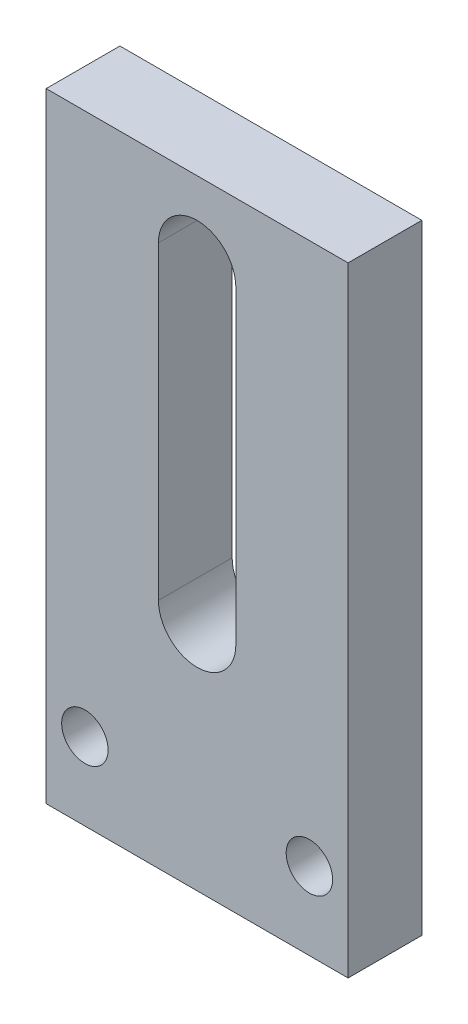
ISO-10303-21;
HEADER;
FILE_DESCRIPTION(('STEP AP214'),'2;1');
FILE_NAME('part.step','',(''),(''),'','','');
FILE_SCHEMA(('AUTOMOTIVE_DESIGN { 1 0 10303 214 1 1 1 1 }'));
ENDSEC;
DATA;
#1=APPLICATION_CONTEXT('core data for automotive mechanical design processes');
#2=APPLICATION_PROTOCOL_DEFINITION('international standard','automotive_design',2000,#1);
#3=PRODUCT_CONTEXT('',#1,'mechanical');
#4=PRODUCT('Part','Part','',(#3));
#5=PRODUCT_RELATED_PRODUCT_CATEGORY('part','',(#4));
#6=PRODUCT_DEFINITION_FORMATION('','',#4);
#7=PRODUCT_DEFINITION_CONTEXT('part definition',#1,'design');
#8=PRODUCT_DEFINITION('design','',#6,#7);
#9=PRODUCT_DEFINITION_SHAPE('','',#8);
#10=(LENGTH_UNIT() NAMED_UNIT(*) SI_UNIT(.MILLI.,.METRE.));
#11=(NAMED_UNIT(*) PLANE_ANGLE_UNIT() SI_UNIT($,.RADIAN.));
#12=(NAMED_UNIT(*) SI_UNIT($,.STERADIAN.) SOLID_ANGLE_UNIT());
#13=UNCERTAINTY_MEASURE_WITH_UNIT(LENGTH_MEASURE(1.E-05),#10,'distance_accuracy_value','');
#14=(GEOMETRIC_REPRESENTATION_CONTEXT(3) GLOBAL_UNCERTAINTY_ASSIGNED_CONTEXT((#13)) GLOBAL_UNIT_ASSIGNED_CONTEXT((#10,
#11,#12)) REPRESENTATION_CONTEXT('',''));
#15=CARTESIAN_POINT('',(0.,0.,0.));
#16=DIRECTION('',(0.,0.,1.));
#17=DIRECTION('',(1.,0.,0.));
#18=AXIS2_PLACEMENT_3D('',#15,#16,#17);
#19=CARTESIAN_POINT('',(9.75,35.,4.7625));
#20=DIRECTION('',(0.,0.,-1.));
#21=DIRECTION('',(-1.,0.,0.));
#22=AXIS2_PLACEMENT_3D('',#19,#20,#21);
#23=CYLINDRICAL_SURFACE('',#22,2.5);
#24=CARTESIAN_POINT('',(9.75,35.,0.));
#25=DIRECTION('',(0.,0.,1.));
#26=DIRECTION('',(1.,0.,0.));
#27=AXIS2_PLACEMENT_3D('',#24,#25,#26);
#28=CIRCLE('',#27,2.5);
#29=CARTESIAN_POINT('',(12.25,35.,0.));
#30=VERTEX_POINT('',#29);
#31=CARTESIAN_POINT('',(7.25,35.,0.));
#32=VERTEX_POINT('',#31);
#33=EDGE_CURVE('E152',#30,#32,#28,.T.);
#34=ORIENTED_EDGE('',*,*,#33,.F.);
#35=DIRECTION('',(0.,0.,-1.));
#36=VECTOR('',#35,1.);
#37=CARTESIAN_POINT('',(12.25,35.,4.7625));
#38=LINE('',#37,#36);
#39=CARTESIAN_POINT('',(12.25,35.,4.7625));
#40=VERTEX_POINT('',#39);
#41=EDGE_CURVE('E11',#40,#30,#38,.T.);
#42=ORIENTED_EDGE('',*,*,#41,.F.);
#43=CARTESIAN_POINT('',(9.75,35.,4.7625));
#44=DIRECTION('',(0.,0.,1.));
#45=DIRECTION('',(1.,0.,0.));
#46=AXIS2_PLACEMENT_3D('',#43,#44,#45);
#47=CIRCLE('',#46,2.5);
#48=CARTESIAN_POINT('',(7.25,35.,4.7625));
#49=VERTEX_POINT('',#48);
#50=EDGE_CURVE('E117',#40,#49,#47,.T.);
#51=ORIENTED_EDGE('',*,*,#50,.T.);
#52=DIRECTION('',(0.,0.,-1.));
#53=VECTOR('',#52,1.);
#54=CARTESIAN_POINT('',(7.25,35.,4.7625));
#55=LINE('',#54,#53);
#56=EDGE_CURVE('E54',#49,#32,#55,.T.);
#57=ORIENTED_EDGE('',*,*,#56,.T.);
#58=EDGE_LOOP('',(#34,#42,#51,#57));
#59=FACE_BOUND('',#58,.T.);
#60=ADVANCED_FACE('F35',(#59),#23,.F.);
#61=CARTESIAN_POINT('',(12.25,0.,4.7625));
#62=DIRECTION('',(1.,0.,0.));
#63=DIRECTION('',(0.,1.,0.));
#64=AXIS2_PLACEMENT_3D('',#61,#62,#63);
#65=PLANE('',#64);
#66=DIRECTION('',(0.,-1.,0.));
#67=VECTOR('',#66,1.);
#68=CARTESIAN_POINT('',(12.25,0.,0.));
#69=LINE('',#68,#67);
#70=CARTESIAN_POINT('',(12.25,15.,0.));
#71=VERTEX_POINT('',#70);
#72=EDGE_CURVE('E123',#30,#71,#69,.T.);
#73=ORIENTED_EDGE('',*,*,#72,.T.);
#74=DIRECTION('',(0.,0.,-1.));
#75=VECTOR('',#74,1.);
#76=CARTESIAN_POINT('',(12.25,15.,4.7625));
#77=LINE('',#76,#75);
#78=CARTESIAN_POINT('',(12.25,15.,4.7625));
#79=VERTEX_POINT('',#78);
#80=EDGE_CURVE('E45',#79,#71,#77,.T.);
#81=ORIENTED_EDGE('',*,*,#80,.F.);
#82=DIRECTION('',(0.,-1.,0.));
#83=VECTOR('',#82,1.);
#84=CARTESIAN_POINT('',(12.25,0.,4.7625));
#85=LINE('',#84,#83);
#86=EDGE_CURVE('E110',#40,#79,#85,.T.);
#87=ORIENTED_EDGE('',*,*,#86,.F.);
#88=ORIENTED_EDGE('',*,*,#41,.T.);
#89=EDGE_LOOP('',(#73,#81,#87,#88));
#90=FACE_BOUND('',#89,.T.);
#91=ADVANCED_FACE('F121',(#90),#65,.F.);
#92=CARTESIAN_POINT('',(9.75,15.,4.7625));
#93=DIRECTION('',(0.,0.,-1.));
#94=DIRECTION('',(-1.,0.,0.));
#95=AXIS2_PLACEMENT_3D('',#92,#93,#94);
#96=CYLINDRICAL_SURFACE('',#95,2.5);
#97=CARTESIAN_POINT('',(9.75,15.,0.));
#98=DIRECTION('',(0.,0.,1.));
#99=DIRECTION('',(1.,0.,0.));
#100=AXIS2_PLACEMENT_3D('',#97,#98,#99);
#101=CIRCLE('',#100,2.5);
#102=CARTESIAN_POINT('',(7.25,15.,0.));
#103=VERTEX_POINT('',#102);
#104=EDGE_CURVE('E155',#103,#71,#101,.T.);
#105=ORIENTED_EDGE('',*,*,#104,.F.);
#106=DIRECTION('',(0.,0.,-1.));
#107=VECTOR('',#106,1.);
#108=CARTESIAN_POINT('',(7.25,15.,4.7625));
#109=LINE('',#108,#107);
#110=CARTESIAN_POINT('',(7.25,15.,4.7625));
#111=VERTEX_POINT('',#110);
#112=EDGE_CURVE('E79',#111,#103,#109,.T.);
#113=ORIENTED_EDGE('',*,*,#112,.F.);
#114=CARTESIAN_POINT('',(9.75,15.,4.7625));
#115=DIRECTION('',(0.,0.,1.));
#116=DIRECTION('',(1.,0.,0.));
#117=AXIS2_PLACEMENT_3D('',#114,#115,#116);
#118=CIRCLE('',#117,2.5);
#119=EDGE_CURVE('E116',#111,#79,#118,.T.);
#120=ORIENTED_EDGE('',*,*,#119,.T.);
#121=ORIENTED_EDGE('',*,*,#80,.T.);
#122=EDGE_LOOP('',(#105,#113,#120,#121));
#123=FACE_BOUND('',#122,.T.);
#124=ADVANCED_FACE('F127',(#123),#96,.F.);
#125=CARTESIAN_POINT('',(0.,0.,4.7625));
#126=DIRECTION('',(0.,1.,0.));
#127=DIRECTION('',(0.,0.,1.));
#128=AXIS2_PLACEMENT_3D('',#125,#126,#127);
#129=PLANE('',#128);
#130=DIRECTION('',(1.,0.,0.));
#131=VECTOR('',#130,1.);
#132=CARTESIAN_POINT('',(0.,0.,0.));
#133=LINE('',#132,#131);
#134=CARTESIAN_POINT('',(0.,0.,0.));
#135=VERTEX_POINT('',#134);
#136=CARTESIAN_POINT('',(19.5,0.,0.));
#137=VERTEX_POINT('',#136);
#138=EDGE_CURVE('E140',#135,#137,#133,.T.);
#139=ORIENTED_EDGE('',*,*,#138,.T.);
#140=DIRECTION('',(0.,0.,-1.));
#141=VECTOR('',#140,1.);
#142=CARTESIAN_POINT('',(19.5,0.,4.7625));
#143=LINE('',#142,#141);
#144=CARTESIAN_POINT('',(19.5,0.,4.7625));
#145=VERTEX_POINT('',#144);
#146=EDGE_CURVE('E39',#145,#137,#143,.T.);
#147=ORIENTED_EDGE('',*,*,#146,.F.);
#148=DIRECTION('',(1.,0.,0.));
#149=VECTOR('',#148,1.);
#150=CARTESIAN_POINT('',(0.,0.,4.7625));
#151=LINE('',#150,#149);
#152=CARTESIAN_POINT('',(0.,0.,4.7625));
#153=VERTEX_POINT('',#152);
#154=EDGE_CURVE('E92',#153,#145,#151,.T.);
#155=ORIENTED_EDGE('',*,*,#154,.F.);
#156=DIRECTION('',(0.,0.,-1.));
#157=VECTOR('',#156,1.);
#158=CARTESIAN_POINT('',(0.,0.,4.7625));
#159=LINE('',#158,#157);
#160=EDGE_CURVE('E139',#153,#135,#159,.T.);
#161=ORIENTED_EDGE('',*,*,#160,.T.);
#162=EDGE_LOOP('',(#139,#147,#155,#161));
#163=FACE_BOUND('',#162,.T.);
#164=ADVANCED_FACE('F37',(#163),#129,.F.);
#165=CARTESIAN_POINT('',(19.5,0.,4.7625));
#166=DIRECTION('',(1.,0.,0.));
#167=DIRECTION('',(0.,1.,0.));
#168=AXIS2_PLACEMENT_3D('',#165,#166,#167);
#169=PLANE('',#168);
#170=DIRECTION('',(0.,-1.,0.));
#171=VECTOR('',#170,1.);
#172=CARTESIAN_POINT('',(19.5,0.,0.));
#173=LINE('',#172,#171);
#174=CARTESIAN_POINT('',(19.5,40.,0.));
#175=VERTEX_POINT('',#174);
#176=EDGE_CURVE('E143',#175,#137,#173,.T.);
#177=ORIENTED_EDGE('',*,*,#176,.F.);
#178=DIRECTION('',(0.,0.,-1.));
#179=VECTOR('',#178,1.);
#180=CARTESIAN_POINT('',(19.5,40.,4.7625));
#181=LINE('',#180,#179);
#182=CARTESIAN_POINT('',(19.5,40.,4.7625));
#183=VERTEX_POINT('',#182);
#184=EDGE_CURVE('E170',#183,#175,#181,.T.);
#185=ORIENTED_EDGE('',*,*,#184,.F.);
#186=DIRECTION('',(0.,-1.,0.));
#187=VECTOR('',#186,1.);
#188=CARTESIAN_POINT('',(19.5,0.,4.7625));
#189=LINE('',#188,#187);
#190=EDGE_CURVE('E178',#183,#145,#189,.T.);
#191=ORIENTED_EDGE('',*,*,#190,.T.);
#192=ORIENTED_EDGE('',*,*,#146,.T.);
#193=EDGE_LOOP('',(#177,#185,#191,#192));
#194=FACE_BOUND('',#193,.T.);
#195=ADVANCED_FACE('F177',(#194),#169,.T.);
#196=CARTESIAN_POINT('',(0.,40.,4.7625));
#197=DIRECTION('',(0.,1.,0.));
#198=DIRECTION('',(0.,0.,1.));
#199=AXIS2_PLACEMENT_3D('',#196,#197,#198);
#200=PLANE('',#199);
#201=DIRECTION('',(1.,0.,0.));
#202=VECTOR('',#201,1.);
#203=CARTESIAN_POINT('',(0.,40.,0.));
#204=LINE('',#203,#202);
#205=CARTESIAN_POINT('',(0.,40.,0.));
#206=VERTEX_POINT('',#205);
#207=EDGE_CURVE('E146',#206,#175,#204,.T.);
#208=ORIENTED_EDGE('',*,*,#207,.F.);
#209=DIRECTION('',(0.,0.,-1.));
#210=VECTOR('',#209,1.);
#211=CARTESIAN_POINT('',(0.,40.,4.7625));
#212=LINE('',#211,#210);
#213=CARTESIAN_POINT('',(0.,40.,4.7625));
#214=VERTEX_POINT('',#213);
#215=EDGE_CURVE('E169',#214,#206,#212,.T.);
#216=ORIENTED_EDGE('',*,*,#215,.F.);
#217=DIRECTION('',(1.,0.,0.));
#218=VECTOR('',#217,1.);
#219=CARTESIAN_POINT('',(0.,40.,4.7625));
#220=LINE('',#219,#218);
#221=EDGE_CURVE('E187',#214,#183,#220,.T.);
#222=ORIENTED_EDGE('',*,*,#221,.T.);
#223=ORIENTED_EDGE('',*,*,#184,.T.);
#224=EDGE_LOOP('',(#208,#216,#222,#223));
#225=FACE_BOUND('',#224,.T.);
#226=ADVANCED_FACE('F185',(#225),#200,.T.);
#227=CARTESIAN_POINT('',(17.,5.,4.7625));
#228=DIRECTION('',(0.,0.,-1.));
#229=DIRECTION('',(-1.,0.,0.));
#230=AXIS2_PLACEMENT_3D('',#227,#228,#229);
#231=CYLINDRICAL_SURFACE('',#230,1.5);
#232=CARTESIAN_POINT('',(17.,5.,4.7625));
#233=DIRECTION('',(0.,0.,1.));
#234=DIRECTION('',(1.,0.,0.));
#235=AXIS2_PLACEMENT_3D('',#232,#233,#234);
#236=CIRCLE('',#235,1.5);
#237=CARTESIAN_POINT('',(15.5,5.,4.7625));
#238=VERTEX_POINT('',#237);
#239=EDGE_CURVE('E130',#238,#238,#236,.T.);
#240=CARTESIAN_POINT('',(17.,5.,0.));
#241=DIRECTION('',(0.,0.,1.));
#242=DIRECTION('',(1.,0.,0.));
#243=AXIS2_PLACEMENT_3D('',#240,#241,#242);
#244=CIRCLE('',#243,1.5);
#245=CARTESIAN_POINT('',(15.5,5.,0.));
#246=VERTEX_POINT('',#245);
#247=EDGE_CURVE('E160',#246,#246,#244,.T.);
#248=CARTESIAN_POINT('',(15.5,5.,4.7625));
#249=CARTESIAN_POINT('',(15.5,5.,4.712890625));
#250=CARTESIAN_POINT('',(15.5,5.,4.66328125));
#251=CARTESIAN_POINT('',(15.5,5.,4.5640625));
#252=CARTESIAN_POINT('',(15.5,5.,4.514453125));
#253=CARTESIAN_POINT('',(15.5,5.,4.415234375));
#254=CARTESIAN_POINT('',(15.5,5.,4.365625));
#255=CARTESIAN_POINT('',(15.5,5.,4.26640625));
#256=CARTESIAN_POINT('',(15.5,5.,4.216796875));
#257=CARTESIAN_POINT('',(15.5,5.,4.117578125));
#258=CARTESIAN_POINT('',(15.5,5.,4.06796875));
#259=CARTESIAN_POINT('',(15.5,5.,3.96875));
#260=CARTESIAN_POINT('',(15.5,5.,3.919140625));
#261=CARTESIAN_POINT('',(15.5,5.,3.819921875));
#262=CARTESIAN_POINT('',(15.5,5.,3.7703125));
#263=CARTESIAN_POINT('',(15.5,5.,3.67109375));
#264=CARTESIAN_POINT('',(15.5,5.,3.621484375));
#265=CARTESIAN_POINT('',(15.5,5.,3.522265625));
#266=CARTESIAN_POINT('',(15.5,5.,3.47265625));
#267=CARTESIAN_POINT('',(15.5,5.,3.3734375));
#268=CARTESIAN_POINT('',(15.5,5.,3.323828125));
#269=CARTESIAN_POINT('',(15.5,5.,3.224609375));
#270=CARTESIAN_POINT('',(15.5,5.,3.175));
#271=CARTESIAN_POINT('',(15.5,5.,3.07578125));
#272=CARTESIAN_POINT('',(15.5,5.,3.026171875));
#273=CARTESIAN_POINT('',(15.5,5.,2.926953125));
#274=CARTESIAN_POINT('',(15.5,5.,2.87734375));
#275=CARTESIAN_POINT('',(15.5,5.,2.778125));
#276=CARTESIAN_POINT('',(15.5,5.,2.728515625));
#277=CARTESIAN_POINT('',(15.5,5.,2.629296875));
#278=CARTESIAN_POINT('',(15.5,5.,2.5796875));
#279=CARTESIAN_POINT('',(15.5,5.,2.48046875));
#280=CARTESIAN_POINT('',(15.5,5.,2.430859375));
#281=CARTESIAN_POINT('',(15.5,5.,2.331640625));
#282=CARTESIAN_POINT('',(15.5,5.,2.28203125));
#283=CARTESIAN_POINT('',(15.5,5.,2.1828125));
#284=CARTESIAN_POINT('',(15.5,5.,2.133203125));
#285=CARTESIAN_POINT('',(15.5,5.,2.033984375));
#286=CARTESIAN_POINT('',(15.5,5.,1.984375));
#287=CARTESIAN_POINT('',(15.5,5.,1.88515625));
#288=CARTESIAN_POINT('',(15.5,5.,1.835546875));
#289=CARTESIAN_POINT('',(15.5,5.,1.736328125));
#290=CARTESIAN_POINT('',(15.5,5.,1.68671875));
#291=CARTESIAN_POINT('',(15.5,5.,1.5875));
#292=CARTESIAN_POINT('',(15.5,5.,1.537890625));
#293=CARTESIAN_POINT('',(15.5,5.,1.438671875));
#294=CARTESIAN_POINT('',(15.5,5.,1.3890625));
#295=CARTESIAN_POINT('',(15.5,5.,1.28984375));
#296=CARTESIAN_POINT('',(15.5,5.,1.240234375));
#297=CARTESIAN_POINT('',(15.5,5.,1.141015625));
#298=CARTESIAN_POINT('',(15.5,5.,1.09140625));
#299=CARTESIAN_POINT('',(15.5,5.,0.9921875));
#300=CARTESIAN_POINT('',(15.5,5.,0.942578125));
#301=CARTESIAN_POINT('',(15.5,5.,0.843359375));
#302=CARTESIAN_POINT('',(15.5,5.,0.79375));
#303=CARTESIAN_POINT('',(15.5,5.,0.69453125));
#304=CARTESIAN_POINT('',(15.5,5.,0.644921875));
#305=CARTESIAN_POINT('',(15.5,5.,0.545703125));
#306=CARTESIAN_POINT('',(15.5,5.,0.49609375));
#307=CARTESIAN_POINT('',(15.5,5.,0.396875));
#308=CARTESIAN_POINT('',(15.5,5.,0.347265625));
#309=CARTESIAN_POINT('',(15.5,5.,0.248046875));
#310=CARTESIAN_POINT('',(15.5,5.,0.1984375));
#311=CARTESIAN_POINT('',(15.5,5.,0.09921875));
#312=CARTESIAN_POINT('',(15.5,5.,0.049609375));
#313=CARTESIAN_POINT('',(15.5,5.,0.));
#314=B_SPLINE_CURVE_WITH_KNOTS('',3,(#248,#249,#250,#251,#252,#253,#254,#255,#256,#257,#258,
#259,#260,#261,#262,#263,#264,#265,#266,#267,#268,#269,#270,#271,#272,#273,#274,#275,#276,#277,
#278,#279,#280,#281,#282,#283,#284,#285,#286,#287,#288,#289,#290,#291,#292,#293,#294,#295,#296,
#297,#298,#299,#300,#301,#302,#303,#304,#305,#306,#307,#308,#309,#310,#311,#312,#313),
.UNSPECIFIED.,.F.,.F.,(4,2,2,2,2,2,2,2,2,2,2,2,2,2,2,2,2,2,2,2,2,2,2,2,2,2,2,2,2,2,2,2,4),(0.,
0.148828124999999,0.297656249999999,0.446484374999999,0.595312499999999,0.744140625,0.89296875,
1.041796875,1.190625,1.339453125,1.48828125,1.637109375,1.7859375,1.934765625,2.08359375,
2.232421875,2.38125,2.530078125,2.67890625,2.827734375,2.9765625,3.125390625,3.27421875,
3.423046875,3.571875,3.720703125,3.86953125,4.018359375,4.1671875,4.316015625,4.46484375,
4.613671875,4.7625),.UNSPECIFIED.);
#315=EDGE_CURVE('BSEAM198',#238,#246,#314,.T.);
#316=ORIENTED_EDGE('',*,*,#239,.T.);
#317=ORIENTED_EDGE('',*,*,#247,.F.);
#318=ORIENTED_EDGE('',*,*,#315,.T.);
#319=ORIENTED_EDGE('',*,*,#315,.F.);
#320=EDGE_LOOP('',(#316,#318,#317,#319));
#321=FACE_BOUND('',#320,.T.);
#322=ADVANCED_FACE('F198',(#321),#231,.F.);
#323=CARTESIAN_POINT('',(7.25,0.,4.7625));
#324=DIRECTION('',(1.,0.,0.));
#325=DIRECTION('',(0.,1.,0.));
#326=AXIS2_PLACEMENT_3D('',#323,#324,#325);
#327=PLANE('',#326);
#328=DIRECTION('',(0.,-1.,0.));
#329=VECTOR('',#328,1.);
#330=CARTESIAN_POINT('',(7.25,0.,0.));
#331=LINE('',#330,#329);
#332=EDGE_CURVE('E157',#32,#103,#331,.T.);
#333=ORIENTED_EDGE('',*,*,#332,.F.);
#334=ORIENTED_EDGE('',*,*,#56,.F.);
#335=DIRECTION('',(0.,-1.,0.));
#336=VECTOR('',#335,1.);
#337=CARTESIAN_POINT('',(7.25,0.,4.7625));
#338=LINE('',#337,#336);
#339=EDGE_CURVE('E128',#49,#111,#338,.T.);
#340=ORIENTED_EDGE('',*,*,#339,.T.);
#341=ORIENTED_EDGE('',*,*,#112,.T.);
#342=EDGE_LOOP('',(#333,#334,#340,#341));
#343=FACE_BOUND('',#342,.T.);
#344=ADVANCED_FACE('F196',(#343),#327,.T.);
#345=CARTESIAN_POINT('',(0.,0.,4.7625));
#346=DIRECTION('',(-1.,0.,0.));
#347=DIRECTION('',(0.,0.,1.));
#348=AXIS2_PLACEMENT_3D('',#345,#346,#347);
#349=PLANE('',#348);
#350=DIRECTION('',(0.,1.,0.));
#351=VECTOR('',#350,1.);
#352=CARTESIAN_POINT('',(0.,0.,0.));
#353=LINE('',#352,#351);
#354=EDGE_CURVE('E149',#135,#206,#353,.T.);
#355=ORIENTED_EDGE('',*,*,#354,.F.);
#356=ORIENTED_EDGE('',*,*,#160,.F.);
#357=DIRECTION('',(0.,1.,0.));
#358=VECTOR('',#357,1.);
#359=CARTESIAN_POINT('',(0.,0.,4.7625));
#360=LINE('',#359,#358);
#361=EDGE_CURVE('E190',#153,#214,#360,.T.);
#362=ORIENTED_EDGE('',*,*,#361,.T.);
#363=ORIENTED_EDGE('',*,*,#215,.T.);
#364=EDGE_LOOP('',(#355,#356,#362,#363));
#365=FACE_BOUND('',#364,.T.);
#366=ADVANCED_FACE('F192',(#365),#349,.T.);
#367=CARTESIAN_POINT('',(2.5,5.,4.7625));
#368=DIRECTION('',(0.,0.,-1.));
#369=DIRECTION('',(-1.,0.,0.));
#370=AXIS2_PLACEMENT_3D('',#367,#368,#369);
#371=CYLINDRICAL_SURFACE('',#370,1.5);
#372=CARTESIAN_POINT('',(2.5,5.,4.7625));
#373=DIRECTION('',(0.,0.,1.));
#374=DIRECTION('',(1.,0.,0.));
#375=AXIS2_PLACEMENT_3D('',#372,#373,#374);
#376=CIRCLE('',#375,1.5);
#377=CARTESIAN_POINT('',(0.999999999999999,5.,4.7625));
#378=VERTEX_POINT('',#377);
#379=EDGE_CURVE('E136',#378,#378,#376,.T.);
#380=CARTESIAN_POINT('',(2.5,5.,0.));
#381=DIRECTION('',(0.,0.,1.));
#382=DIRECTION('',(1.,0.,0.));
#383=AXIS2_PLACEMENT_3D('',#380,#381,#382);
#384=CIRCLE('',#383,1.5);
#385=CARTESIAN_POINT('',(0.999999999999999,5.,0.));
#386=VERTEX_POINT('',#385);
#387=EDGE_CURVE('E163',#386,#386,#384,.T.);
#388=CARTESIAN_POINT('',(0.999999999999999,5.,4.7625));
#389=CARTESIAN_POINT('',(0.999999999999999,5.,4.712890625));
#390=CARTESIAN_POINT('',(0.999999999999999,5.,4.66328125));
#391=CARTESIAN_POINT('',(0.999999999999999,5.,4.5640625));
#392=CARTESIAN_POINT('',(0.999999999999999,5.,4.514453125));
#393=CARTESIAN_POINT('',(0.999999999999999,5.,4.415234375));
#394=CARTESIAN_POINT('',(0.999999999999999,5.,4.365625));
#395=CARTESIAN_POINT('',(0.999999999999999,5.,4.26640625));
#396=CARTESIAN_POINT('',(0.999999999999999,5.,4.216796875));
#397=CARTESIAN_POINT('',(0.999999999999999,5.,4.117578125));
#398=CARTESIAN_POINT('',(0.999999999999999,5.,4.06796875));
#399=CARTESIAN_POINT('',(0.999999999999999,5.,3.96875));
#400=CARTESIAN_POINT('',(0.999999999999999,5.,3.919140625));
#401=CARTESIAN_POINT('',(0.999999999999999,5.,3.819921875));
#402=CARTESIAN_POINT('',(0.999999999999999,5.,3.7703125));
#403=CARTESIAN_POINT('',(0.999999999999999,5.,3.67109375));
#404=CARTESIAN_POINT('',(0.999999999999999,5.,3.621484375));
#405=CARTESIAN_POINT('',(0.999999999999999,5.,3.522265625));
#406=CARTESIAN_POINT('',(0.999999999999999,5.,3.47265625));
#407=CARTESIAN_POINT('',(0.999999999999999,5.,3.3734375));
#408=CARTESIAN_POINT('',(0.999999999999999,5.,3.323828125));
#409=CARTESIAN_POINT('',(0.999999999999999,5.,3.224609375));
#410=CARTESIAN_POINT('',(0.999999999999999,5.,3.175));
#411=CARTESIAN_POINT('',(0.999999999999999,5.,3.07578125));
#412=CARTESIAN_POINT('',(0.999999999999999,5.,3.026171875));
#413=CARTESIAN_POINT('',(0.999999999999999,5.,2.926953125));
#414=CARTESIAN_POINT('',(0.999999999999999,5.,2.87734375));
#415=CARTESIAN_POINT('',(0.999999999999999,5.,2.778125));
#416=CARTESIAN_POINT('',(0.999999999999999,5.,2.728515625));
#417=CARTESIAN_POINT('',(0.999999999999999,5.,2.629296875));
#418=CARTESIAN_POINT('',(0.999999999999999,5.,2.5796875));
#419=CARTESIAN_POINT('',(0.999999999999999,5.,2.48046875));
#420=CARTESIAN_POINT('',(0.999999999999999,5.,2.430859375));
#421=CARTESIAN_POINT('',(0.999999999999999,5.,2.331640625));
#422=CARTESIAN_POINT('',(0.999999999999999,5.,2.28203125));
#423=CARTESIAN_POINT('',(0.999999999999999,5.,2.1828125));
#424=CARTESIAN_POINT('',(0.999999999999999,5.,2.133203125));
#425=CARTESIAN_POINT('',(0.999999999999999,5.,2.033984375));
#426=CARTESIAN_POINT('',(0.999999999999999,5.,1.984375));
#427=CARTESIAN_POINT('',(0.999999999999999,5.,1.88515625));
#428=CARTESIAN_POINT('',(0.999999999999999,5.,1.835546875));
#429=CARTESIAN_POINT('',(0.999999999999999,5.,1.736328125));
#430=CARTESIAN_POINT('',(0.999999999999999,5.,1.68671875));
#431=CARTESIAN_POINT('',(0.999999999999999,5.,1.5875));
#432=CARTESIAN_POINT('',(0.999999999999999,5.,1.537890625));
#433=CARTESIAN_POINT('',(0.999999999999999,5.,1.438671875));
#434=CARTESIAN_POINT('',(0.999999999999999,5.,1.3890625));
#435=CARTESIAN_POINT('',(0.999999999999999,5.,1.28984375));
#436=CARTESIAN_POINT('',(0.999999999999999,5.,1.240234375));
#437=CARTESIAN_POINT('',(0.999999999999999,5.,1.141015625));
#438=CARTESIAN_POINT('',(0.999999999999999,5.,1.09140625));
#439=CARTESIAN_POINT('',(0.999999999999999,5.,0.9921875));
#440=CARTESIAN_POINT('',(0.999999999999999,5.,0.942578125));
#441=CARTESIAN_POINT('',(0.999999999999999,5.,0.843359375));
#442=CARTESIAN_POINT('',(0.999999999999999,5.,0.79375));
#443=CARTESIAN_POINT('',(0.999999999999999,5.,0.69453125));
#444=CARTESIAN_POINT('',(0.999999999999999,5.,0.644921875));
#445=CARTESIAN_POINT('',(0.999999999999999,5.,0.545703125));
#446=CARTESIAN_POINT('',(0.999999999999999,5.,0.49609375));
#447=CARTESIAN_POINT('',(0.999999999999999,5.,0.396875));
#448=CARTESIAN_POINT('',(0.999999999999999,5.,0.347265625));
#449=CARTESIAN_POINT('',(0.999999999999999,5.,0.248046875));
#450=CARTESIAN_POINT('',(0.999999999999999,5.,0.1984375));
#451=CARTESIAN_POINT('',(0.999999999999999,5.,0.09921875));
#452=CARTESIAN_POINT('',(0.999999999999999,5.,0.049609375));
#453=CARTESIAN_POINT('',(0.999999999999999,5.,0.));
#454=B_SPLINE_CURVE_WITH_KNOTS('',3,(#388,#389,#390,#391,#392,#393,#394,#395,#396,#397,#398,
#399,#400,#401,#402,#403,#404,#405,#406,#407,#408,#409,#410,#411,#412,#413,#414,#415,#416,#417,
#418,#419,#420,#421,#422,#423,#424,#425,#426,#427,#428,#429,#430,#431,#432,#433,#434,#435,#436,
#437,#438,#439,#440,#441,#442,#443,#444,#445,#446,#447,#448,#449,#450,#451,#452,#453),
.UNSPECIFIED.,.F.,.F.,(4,2,2,2,2,2,2,2,2,2,2,2,2,2,2,2,2,2,2,2,2,2,2,2,2,2,2,2,2,2,2,2,4),(0.,
0.148828124999999,0.297656249999999,0.446484374999999,0.595312499999999,0.744140625,0.89296875,
1.041796875,1.190625,1.339453125,1.48828125,1.637109375,1.7859375,1.934765625,2.08359375,
2.232421875,2.38125,2.530078125,2.67890625,2.827734375,2.9765625,3.125390625,3.27421875,
3.423046875,3.571875,3.720703125,3.86953125,4.018359375,4.1671875,4.316015625,4.46484375,
4.613671875,4.7625),.UNSPECIFIED.);
#455=EDGE_CURVE('BSEAM204',#378,#386,#454,.T.);
#456=ORIENTED_EDGE('',*,*,#379,.T.);
#457=ORIENTED_EDGE('',*,*,#387,.F.);
#458=ORIENTED_EDGE('',*,*,#455,.T.);
#459=ORIENTED_EDGE('',*,*,#455,.F.);
#460=EDGE_LOOP('',(#456,#458,#457,#459));
#461=FACE_BOUND('',#460,.T.);
#462=ADVANCED_FACE('F204',(#461),#371,.F.);
#463=CARTESIAN_POINT('',(0.,0.,4.7625));
#464=DIRECTION('',(0.,0.,1.));
#465=DIRECTION('',(1.,0.,0.));
#466=AXIS2_PLACEMENT_3D('',#463,#464,#465);
#467=PLANE('',#466);
#468=ORIENTED_EDGE('',*,*,#154,.T.);
#469=ORIENTED_EDGE('',*,*,#190,.F.);
#470=ORIENTED_EDGE('',*,*,#221,.F.);
#471=ORIENTED_EDGE('',*,*,#361,.F.);
#472=EDGE_LOOP('',(#468,#469,#470,#471));
#473=FACE_BOUND('',#472,.T.);
#474=ORIENTED_EDGE('',*,*,#50,.F.);
#475=ORIENTED_EDGE('',*,*,#86,.T.);
#476=ORIENTED_EDGE('',*,*,#119,.F.);
#477=ORIENTED_EDGE('',*,*,#339,.F.);
#478=EDGE_LOOP('',(#474,#475,#476,#477));
#479=FACE_BOUND('',#478,.T.);
#480=ORIENTED_EDGE('',*,*,#239,.F.);
#481=EDGE_LOOP('',(#480));
#482=FACE_BOUND('',#481,.T.);
#483=ORIENTED_EDGE('',*,*,#379,.F.);
#484=EDGE_LOOP('',(#483));
#485=FACE_BOUND('',#484,.T.);
#486=ADVANCED_FACE('F112',(#473,#479,#482,#485),#467,.T.);
#487=CARTESIAN_POINT('',(0.,0.,0.));
#488=DIRECTION('',(0.,0.,1.));
#489=DIRECTION('',(1.,0.,0.));
#490=AXIS2_PLACEMENT_3D('',#487,#488,#489);
#491=PLANE('',#490);
#492=ORIENTED_EDGE('',*,*,#138,.F.);
#493=ORIENTED_EDGE('',*,*,#354,.T.);
#494=ORIENTED_EDGE('',*,*,#207,.T.);
#495=ORIENTED_EDGE('',*,*,#176,.T.);
#496=EDGE_LOOP('',(#492,#493,#494,#495));
#497=FACE_BOUND('',#496,.T.);
#498=ORIENTED_EDGE('',*,*,#33,.T.);
#499=ORIENTED_EDGE('',*,*,#332,.T.);
#500=ORIENTED_EDGE('',*,*,#104,.T.);
#501=ORIENTED_EDGE('',*,*,#72,.F.);
#502=EDGE_LOOP('',(#498,#499,#500,#501));
#503=FACE_BOUND('',#502,.T.);
#504=ORIENTED_EDGE('',*,*,#247,.T.);
#505=EDGE_LOOP('',(#504));
#506=FACE_BOUND('',#505,.T.);
#507=ORIENTED_EDGE('',*,*,#387,.T.);
#508=EDGE_LOOP('',(#507));
#509=FACE_BOUND('',#508,.T.);
#510=ADVANCED_FACE('F183',(#497,#503,#506,#509),#491,.F.);
#511=CLOSED_SHELL('',(#60,#91,#124,#164,#195,#226,#322,#344,#366,#462,#486,#510));
#512=MANIFOLD_SOLID_BREP('B2',#511);
#513=ADVANCED_BREP_SHAPE_REPRESENTATION('',(#18,#512),#14);
#514=SHAPE_DEFINITION_REPRESENTATION(#9,#513);
ENDSEC;
END-ISO-10303-21;
